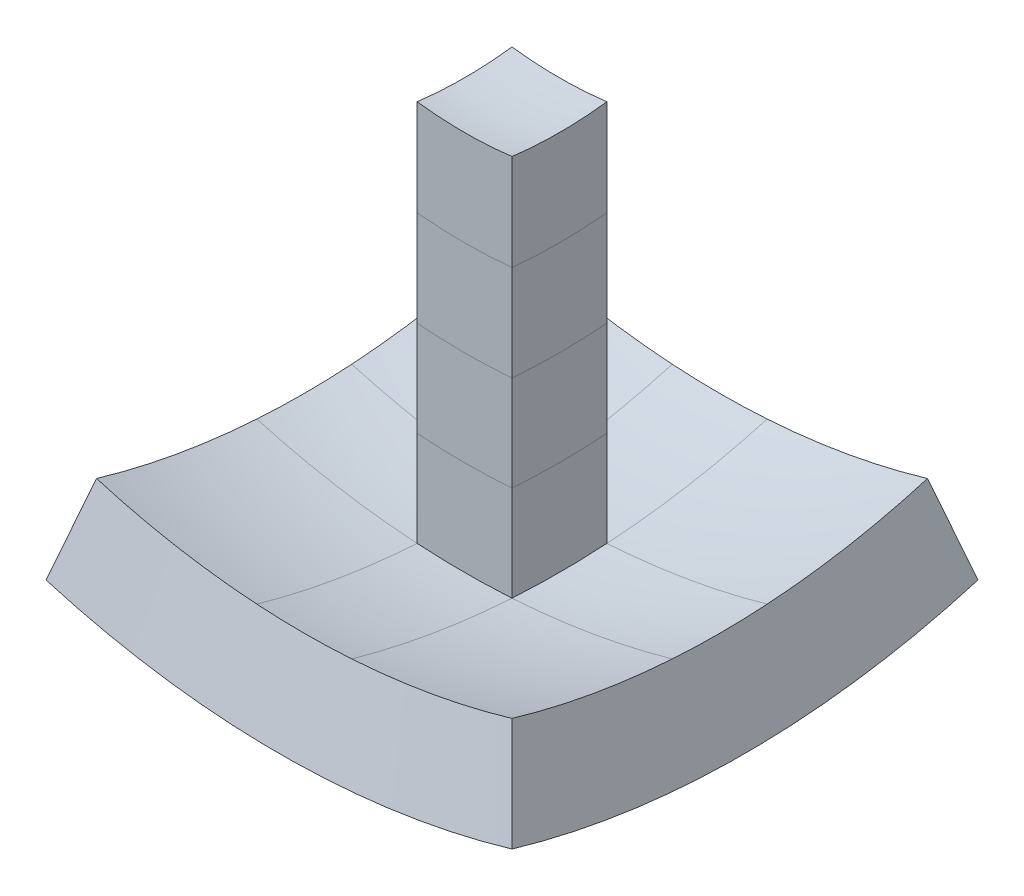
ISO-10303-21;
HEADER;
FILE_DESCRIPTION(('STEP AP214'),'2;1');
FILE_NAME('part.step','',(''),(''),'','','');
FILE_SCHEMA(('AUTOMOTIVE_DESIGN { 1 0 10303 214 1 1 1 1 }'));
ENDSEC;
DATA;
#1=APPLICATION_CONTEXT('core data for automotive mechanical design processes');
#2=APPLICATION_PROTOCOL_DEFINITION('international standard','automotive_design',2000,#1);
#3=PRODUCT_CONTEXT('',#1,'mechanical');
#4=PRODUCT('Part','Part','',(#3));
#5=PRODUCT_RELATED_PRODUCT_CATEGORY('part','',(#4));
#6=PRODUCT_DEFINITION_FORMATION('','',#4);
#7=PRODUCT_DEFINITION_CONTEXT('part definition',#1,'design');
#8=PRODUCT_DEFINITION('design','',#6,#7);
#9=PRODUCT_DEFINITION_SHAPE('','',#8);
#10=(LENGTH_UNIT() NAMED_UNIT(*) SI_UNIT(.MILLI.,.METRE.));
#11=(NAMED_UNIT(*) PLANE_ANGLE_UNIT() SI_UNIT($,.RADIAN.));
#12=(NAMED_UNIT(*) SI_UNIT($,.STERADIAN.) SOLID_ANGLE_UNIT());
#13=UNCERTAINTY_MEASURE_WITH_UNIT(LENGTH_MEASURE(1.E-05),#10,'distance_accuracy_value','');
#14=(GEOMETRIC_REPRESENTATION_CONTEXT(3) GLOBAL_UNCERTAINTY_ASSIGNED_CONTEXT((#13)) GLOBAL_UNIT_ASSIGNED_CONTEXT((#10,
#11,#12)) REPRESENTATION_CONTEXT('',''));
#15=CARTESIAN_POINT('',(0.,0.,0.));
#16=DIRECTION('',(0.,0.,1.));
#17=DIRECTION('',(1.,0.,0.));
#18=AXIS2_PLACEMENT_3D('',#15,#16,#17);
#19=CARTESIAN_POINT('',(0.,0.,0.));
#20=DIRECTION('',(0.,0.,1.));
#21=DIRECTION('',(1.,0.,0.));
#22=AXIS2_PLACEMENT_3D('',#19,#20,#21);
#23=SPHERICAL_SURFACE('',#22,31.0257167104902);
#24=CARTESIAN_POINT('',(0.,0.,3.93001566353264));
#25=DIRECTION('',(0.,0.,1.));
#26=DIRECTION('',(-1.,0.,0.));
#27=AXIS2_PLACEMENT_3D('',#24,#25,#26);
#28=CIRCLE('',#27,30.7758033897408);
#29=CARTESIAN_POINT('',(-8.46895918869349,-29.587612349499,3.93001566353254));
#30=VERTEX_POINT('',#29);
#31=CARTESIAN_POINT('',(-3.93001566353253,-30.5238439775918,3.93001566353253));
#32=VERTEX_POINT('',#31);
#33=EDGE_CURVE('E314',#30,#32,#28,.T.);
#34=ORIENTED_EDGE('',*,*,#33,.T.);
#35=CARTESIAN_POINT('',(-3.93001566353264,0.,0.));
#36=DIRECTION('',(-1.,0.,0.));
#37=DIRECTION('',(0.,-1.,0.));
#38=AXIS2_PLACEMENT_3D('',#35,#36,#37);
#39=CIRCLE('',#38,30.7758033897408);
#40=CARTESIAN_POINT('',(-3.93001566353253,-29.587612349499,8.46895918869349));
#41=VERTEX_POINT('',#40);
#42=EDGE_CURVE('E49',#32,#41,#39,.T.);
#43=ORIENTED_EDGE('',*,*,#42,.T.);
#44=CARTESIAN_POINT('',(0.,0.,8.46895918869359));
#45=DIRECTION('',(0.,0.,1.));
#46=DIRECTION('',(-1.,0.,0.));
#47=AXIS2_PLACEMENT_3D('',#44,#45,#46);
#48=CIRCLE('',#47,29.8474760685026);
#49=CARTESIAN_POINT('',(-8.46895918869349,-28.6207714417358,8.46895918869349));
#50=VERTEX_POINT('',#49);
#51=EDGE_CURVE('E113',#50,#41,#48,.T.);
#52=ORIENTED_EDGE('',*,*,#51,.F.);
#53=CARTESIAN_POINT('',(-8.4689591886936,0.,0.));
#54=DIRECTION('',(1.,0.,0.));
#55=DIRECTION('',(0.,1.,0.));
#56=AXIS2_PLACEMENT_3D('',#53,#54,#55);
#57=CIRCLE('',#56,29.8474760685026);
#58=EDGE_CURVE('E127',#50,#30,#57,.T.);
#59=ORIENTED_EDGE('',*,*,#58,.T.);
#60=EDGE_LOOP('',(#34,#43,#52,#59));
#61=FACE_BOUND('',#60,.T.);
#62=ADVANCED_FACE('F37',(#61),#23,.T.);
#63=CARTESIAN_POINT('',(32.5,0.,3.93001566353274));
#64=DIRECTION('',(0.,0.,1.));
#65=DIRECTION('',(-1.,0.,0.));
#66=AXIS2_PLACEMENT_3D('',#63,#64,#65);
#67=PLANE('',#66);
#68=DIRECTION('',(-1.,0.,0.));
#69=VECTOR('',#68,1.);
#70=CARTESIAN_POINT('',(-32.5,-32.5,3.93001566353261));
#71=LINE('',#70,#69);
#72=CARTESIAN_POINT('',(3.93001566353283,-32.5,3.93001566353254));
#73=VERTEX_POINT('',#72);
#74=CARTESIAN_POINT('',(-3.93001566353261,-32.5,3.93001566353254));
#75=VERTEX_POINT('',#74);
#76=EDGE_CURVE('E616',#73,#75,#71,.T.);
#77=ORIENTED_EDGE('',*,*,#76,.F.);
#78=DIRECTION('',(0.,1.,0.));
#79=VECTOR('',#78,1.);
#80=CARTESIAN_POINT('',(3.93001566353273,-1.08224922532E-13,3.93001566353273));
#81=LINE('',#80,#79);
#82=CARTESIAN_POINT('',(3.93001566353274,-30.5238439775918,3.93001566353253));
#83=VERTEX_POINT('',#82);
#84=EDGE_CURVE('E480',#73,#83,#81,.T.);
#85=ORIENTED_EDGE('',*,*,#84,.T.);
#86=EDGE_CURVE('E315',#32,#83,#28,.T.);
#87=ORIENTED_EDGE('',*,*,#86,.F.);
#88=DIRECTION('',(0.,-1.,0.));
#89=VECTOR('',#88,1.);
#90=CARTESIAN_POINT('',(-3.93001566353273,-1.47608381524858E-13,3.93001566353273));
#91=LINE('',#90,#89);
#92=EDGE_CURVE('E139',#32,#75,#91,.T.);
#93=ORIENTED_EDGE('',*,*,#92,.T.);
#94=EDGE_LOOP('',(#77,#85,#87,#93));
#95=FACE_BOUND('',#94,.T.);
#96=ADVANCED_FACE('F250',(#95),#67,.T.);
#97=CARTESIAN_POINT('',(3.93001566353262,32.5,0.));
#98=DIRECTION('',(1.,0.,0.));
#99=DIRECTION('',(0.,-1.,0.));
#100=AXIS2_PLACEMENT_3D('',#97,#98,#99);
#101=PLANE('',#100);
#102=DIRECTION('',(0.,0.,1.));
#103=VECTOR('',#102,1.);
#104=CARTESIAN_POINT('',(3.93001566353283,-32.5,-32.5));
#105=LINE('',#104,#103);
#106=CARTESIAN_POINT('',(3.93001566353274,-32.5,-3.93001566353284));
#107=VERTEX_POINT('',#106);
#108=EDGE_CURVE('E544',#107,#73,#105,.T.);
#109=ORIENTED_EDGE('',*,*,#108,.F.);
#110=DIRECTION('',(0.,-1.,0.));
#111=VECTOR('',#110,1.);
#112=CARTESIAN_POINT('',(3.93001566353273,0.,-3.93001566353273));
#113=LINE('',#112,#111);
#114=CARTESIAN_POINT('',(3.93001566353274,-30.5238439775918,-3.93001566353275));
#115=VERTEX_POINT('',#114);
#116=EDGE_CURVE('E404',#115,#107,#113,.T.);
#117=ORIENTED_EDGE('',*,*,#116,.F.);
#118=CARTESIAN_POINT('',(3.93001566353264,0.,0.));
#119=DIRECTION('',(-1.,0.,0.));
#120=DIRECTION('',(0.,-1.,0.));
#121=AXIS2_PLACEMENT_3D('',#118,#119,#120);
#122=CIRCLE('',#121,30.7758033897408);
#123=EDGE_CURVE('E142',#115,#83,#122,.T.);
#124=ORIENTED_EDGE('',*,*,#123,.T.);
#125=ORIENTED_EDGE('',*,*,#84,.F.);
#126=EDGE_LOOP('',(#109,#117,#124,#125));
#127=FACE_BOUND('',#126,.T.);
#128=ADVANCED_FACE('F258',(#127),#101,.T.);
#129=ORIENTED_EDGE('',*,*,#42,.F.);
#130=ORIENTED_EDGE('',*,*,#86,.T.);
#131=CARTESIAN_POINT('',(3.93001566353274,-29.5876123494989,8.46895918869349));
#132=VERTEX_POINT('',#131);
#133=EDGE_CURVE('E134',#83,#132,#122,.T.);
#134=ORIENTED_EDGE('',*,*,#133,.T.);
#135=EDGE_CURVE('E57',#41,#132,#48,.T.);
#136=ORIENTED_EDGE('',*,*,#135,.F.);
#137=EDGE_LOOP('',(#129,#130,#134,#136));
#138=FACE_BOUND('',#137,.T.);
#139=ADVANCED_FACE('F264',(#138),#23,.T.);
#140=CARTESIAN_POINT('',(-3.93001566353285,32.4999999999999,0.));
#141=DIRECTION('',(-1.,0.,0.));
#142=DIRECTION('',(0.,-1.,0.));
#143=AXIS2_PLACEMENT_3D('',#140,#141,#142);
#144=PLANE('',#143);
#145=DIRECTION('',(0.,0.,-1.));
#146=VECTOR('',#145,1.);
#147=CARTESIAN_POINT('',(-3.93001566353261,-32.5,-32.5));
#148=LINE('',#147,#146);
#149=CARTESIAN_POINT('',(-3.93001566353256,-32.5,-3.93001566353284));
#150=VERTEX_POINT('',#149);
#151=EDGE_CURVE('E545',#75,#150,#148,.T.);
#152=ORIENTED_EDGE('',*,*,#151,.F.);
#153=ORIENTED_EDGE('',*,*,#92,.F.);
#154=CARTESIAN_POINT('',(-3.93001566353262,-30.5238439775918,-3.93001566353275));
#155=VERTEX_POINT('',#154);
#156=EDGE_CURVE('E11',#155,#32,#39,.T.);
#157=ORIENTED_EDGE('',*,*,#156,.F.);
#158=DIRECTION('',(0.,1.,0.));
#159=VECTOR('',#158,1.);
#160=CARTESIAN_POINT('',(-3.93001566353273,-1.20165228823687E-13,-3.93001566353273));
#161=LINE('',#160,#159);
#162=EDGE_CURVE('E406',#150,#155,#161,.T.);
#163=ORIENTED_EDGE('',*,*,#162,.F.);
#164=EDGE_LOOP('',(#152,#153,#157,#163));
#165=FACE_BOUND('',#164,.T.);
#166=ADVANCED_FACE('F261',(#165),#144,.T.);
#167=CARTESIAN_POINT('',(0.,0.,0.));
#168=DIRECTION('',(-1.,0.,0.));
#169=DIRECTION('',(0.,1.,0.));
#170=AXIS2_PLACEMENT_3D('',#167,#168,#169);
#171=SPHERICAL_SURFACE('',#170,31.0257167104902);
#172=CARTESIAN_POINT('',(0.,0.,-3.93001566353264));
#173=DIRECTION('',(0.,0.,1.));
#174=DIRECTION('',(-1.,0.,0.));
#175=AXIS2_PLACEMENT_3D('',#172,#173,#174);
#176=CIRCLE('',#175,30.7758033897408);
#177=CARTESIAN_POINT('',(-8.46895918869348,-29.5876123494989,-3.93001566353274));
#178=VERTEX_POINT('',#177);
#179=EDGE_CURVE('E329',#178,#155,#176,.T.);
#180=ORIENTED_EDGE('',*,*,#179,.T.);
#181=ORIENTED_EDGE('',*,*,#156,.T.);
#182=ORIENTED_EDGE('',*,*,#33,.F.);
#183=CARTESIAN_POINT('',(-8.46895918869359,0.,0.));
#184=DIRECTION('',(-1.,0.,0.));
#185=DIRECTION('',(0.,-1.,0.));
#186=AXIS2_PLACEMENT_3D('',#183,#184,#185);
#187=CIRCLE('',#186,29.8474760685026);
#188=EDGE_CURVE('E47',#178,#30,#187,.T.);
#189=ORIENTED_EDGE('',*,*,#188,.F.);
#190=EDGE_LOOP('',(#180,#181,#182,#189));
#191=FACE_BOUND('',#190,.T.);
#192=ADVANCED_FACE('F207',(#191),#171,.T.);
#193=CARTESIAN_POINT('',(32.5,0.,-3.93001566353274));
#194=DIRECTION('',(0.,0.,-1.));
#195=DIRECTION('',(-1.,0.,0.));
#196=AXIS2_PLACEMENT_3D('',#193,#194,#195);
#197=PLANE('',#196);
#198=DIRECTION('',(1.,0.,0.));
#199=VECTOR('',#198,1.);
#200=CARTESIAN_POINT('',(-32.5,-32.5,-3.93001566353283));
#201=LINE('',#200,#199);
#202=EDGE_CURVE('E356',#150,#107,#201,.T.);
#203=ORIENTED_EDGE('',*,*,#202,.F.);
#204=ORIENTED_EDGE('',*,*,#162,.T.);
#205=EDGE_CURVE('E326',#155,#115,#176,.T.);
#206=ORIENTED_EDGE('',*,*,#205,.T.);
#207=ORIENTED_EDGE('',*,*,#116,.T.);
#208=EDGE_LOOP('',(#203,#204,#206,#207));
#209=FACE_BOUND('',#208,.T.);
#210=ADVANCED_FACE('F255',(#209),#197,.T.);
#211=CARTESIAN_POINT('',(0.,0.,0.));
#212=DIRECTION('',(1.,0.,0.));
#213=DIRECTION('',(0.,1.,0.));
#214=AXIS2_PLACEMENT_3D('',#211,#212,#213);
#215=SPHERICAL_SURFACE('',#214,31.0257167104902);
#216=CARTESIAN_POINT('',(8.46895918869369,-29.5876123494989,-3.93001566353275));
#217=VERTEX_POINT('',#216);
#218=EDGE_CURVE('E330',#115,#217,#176,.T.);
#219=ORIENTED_EDGE('',*,*,#218,.T.);
#220=CARTESIAN_POINT('',(8.46895918869359,0.,0.));
#221=DIRECTION('',(-1.,0.,0.));
#222=DIRECTION('',(0.,-1.,0.));
#223=AXIS2_PLACEMENT_3D('',#220,#221,#222);
#224=CIRCLE('',#223,29.8474760685026);
#225=CARTESIAN_POINT('',(8.46895918869369,-29.5876123494989,3.93001566353254));
#226=VERTEX_POINT('',#225);
#227=EDGE_CURVE('E307',#217,#226,#224,.T.);
#228=ORIENTED_EDGE('',*,*,#227,.T.);
#229=EDGE_CURVE('E122',#83,#226,#28,.T.);
#230=ORIENTED_EDGE('',*,*,#229,.F.);
#231=ORIENTED_EDGE('',*,*,#123,.F.);
#232=EDGE_LOOP('',(#219,#228,#230,#231));
#233=FACE_BOUND('',#232,.T.);
#234=ADVANCED_FACE('F233',(#233),#215,.T.);
#235=CARTESIAN_POINT('',(0.,0.,0.));
#236=DIRECTION('',(0.,0.,-1.));
#237=DIRECTION('',(1.,0.,0.));
#238=AXIS2_PLACEMENT_3D('',#235,#236,#237);
#239=SPHERICAL_SURFACE('',#238,31.0257167104902);
#240=ORIENTED_EDGE('',*,*,#205,.F.);
#241=CARTESIAN_POINT('',(-3.93001566353273,0.,0.));
#242=DIRECTION('',(-1.,0.,0.));
#243=DIRECTION('',(0.,-1.,0.));
#244=AXIS2_PLACEMENT_3D('',#241,#242,#243);
#245=CIRCLE('',#244,30.7758033897408);
#246=CARTESIAN_POINT('',(-3.93001566353262,-29.5876123494989,-8.4689591886937));
#247=VERTEX_POINT('',#246);
#248=EDGE_CURVE('E179',#155,#247,#245,.F.);
#249=ORIENTED_EDGE('',*,*,#248,.T.);
#250=CARTESIAN_POINT('',(0.,0.,-8.46895918869359));
#251=DIRECTION('',(0.,0.,1.));
#252=DIRECTION('',(-1.,0.,0.));
#253=AXIS2_PLACEMENT_3D('',#250,#251,#252);
#254=CIRCLE('',#253,29.8474760685026);
#255=CARTESIAN_POINT('',(3.93001566353274,-29.5876123494989,-8.4689591886937));
#256=VERTEX_POINT('',#255);
#257=EDGE_CURVE('E85',#247,#256,#254,.T.);
#258=ORIENTED_EDGE('',*,*,#257,.T.);
#259=EDGE_CURVE('E141',#256,#115,#122,.T.);
#260=ORIENTED_EDGE('',*,*,#259,.T.);
#261=EDGE_LOOP('',(#240,#249,#258,#260));
#262=FACE_BOUND('',#261,.T.);
#263=ADVANCED_FACE('F190',(#262),#239,.T.);
#264=CARTESIAN_POINT('',(0.,0.,7.55096164403318));
#265=DIRECTION('',(0.,0.,1.));
#266=DIRECTION('',(-1.,0.,0.));
#267=AXIS2_PLACEMENT_3D('',#264,#265,#266);
#268=CONICAL_SURFACE('',#267,26.5234188806966,1.30134475047002);
#269=CARTESIAN_POINT('',(0.,0.,7.55096164403318));
#270=DIRECTION('',(0.,0.,1.));
#271=DIRECTION('',(-1.,0.,0.));
#272=AXIS2_PLACEMENT_3D('',#269,#270,#271);
#273=CIRCLE('',#272,26.5234188806966);
#274=CARTESIAN_POINT('',(-7.55096164403309,-25.4258672884768,7.55096164403309));
#275=VERTEX_POINT('',#274);
#276=CARTESIAN_POINT('',(-1.72419661025937,-26.4673174910126,7.55096164403309));
#277=VERTEX_POINT('',#276);
#278=EDGE_CURVE('E317',#275,#277,#273,.T.);
#279=ORIENTED_EDGE('',*,*,#278,.F.);
#280=CARTESIAN_POINT('',(-7.55076164403309,-25.4251712257405,7.55076164403309));
#281=CARTESIAN_POINT('',(-7.70382731093225,-25.9578876105136,7.70382731093225));
#282=CARTESIAN_POINT('',(-7.85689327310354,-26.4906038256047,7.85689327310354));
#283=CARTESIAN_POINT('',(-8.16302578799034,-27.5560359164224,8.16302578799034));
#284=CARTESIAN_POINT('',(-8.31609234070585,-28.0887517921491,8.31609234070585));
#285=CARTESIAN_POINT('',(-8.46915918869348,-28.6214674981937,8.46915918869349));
#286=B_SPLINE_CURVE_WITH_KNOTS('',3,(#280,#281,#282,#283,#284,#285),.UNSPECIFIED.,.F.,.F.,(4,2,
4),(0.,1.72505202540263,3.45010405080514),.UNSPECIFIED.);
#287=EDGE_CURVE('E133',#275,#50,#286,.T.);
#288=ORIENTED_EDGE('',*,*,#287,.T.);
#289=ORIENTED_EDGE('',*,*,#51,.T.);
#290=ORIENTED_EDGE('',*,*,#135,.T.);
#291=CARTESIAN_POINT('',(8.46895918869369,-28.6207714417357,8.4689591886935));
#292=VERTEX_POINT('',#291);
#293=EDGE_CURVE('E104',#132,#292,#48,.T.);
#294=ORIENTED_EDGE('',*,*,#293,.T.);
#295=CARTESIAN_POINT('',(8.46915918869369,-28.6214674981937,8.4691591886935));
#296=CARTESIAN_POINT('',(8.31609234070606,-28.0887517921491,8.31609234070586));
#297=CARTESIAN_POINT('',(8.16302578799054,-27.5560359164224,8.16302578799035));
#298=CARTESIAN_POINT('',(7.85689327310373,-26.4906038256046,7.85689327310355));
#299=CARTESIAN_POINT('',(7.70382731093244,-25.9578876105136,7.70382731093227));
#300=CARTESIAN_POINT('',(7.55076164403327,-25.4251712257405,7.5507616440331));
#301=B_SPLINE_CURVE_WITH_KNOTS('',3,(#295,#296,#297,#298,#299,#300),.UNSPECIFIED.,.F.,.F.,(4,2,
4),(0.,1.72505202540251,3.45010405080515),.UNSPECIFIED.);
#302=CARTESIAN_POINT('',(7.55096164403326,-25.4258672884767,7.5509616440331));
#303=VERTEX_POINT('',#302);
#304=EDGE_CURVE('E109',#292,#303,#301,.T.);
#305=ORIENTED_EDGE('',*,*,#304,.T.);
#306=CARTESIAN_POINT('',(1.72419661025956,-26.4673174910126,7.55096164403309));
#307=VERTEX_POINT('',#306);
#308=EDGE_CURVE('E94',#307,#303,#273,.T.);
#309=ORIENTED_EDGE('',*,*,#308,.F.);
#310=EDGE_CURVE('E319',#277,#307,#273,.T.);
#311=ORIENTED_EDGE('',*,*,#310,.F.);
#312=EDGE_LOOP('',(#279,#288,#289,#290,#294,#305,#309,#311));
#313=FACE_BOUND('',#312,.T.);
#314=ADVANCED_FACE('F107',(#313),#268,.F.);
#315=CARTESIAN_POINT('',(-7.55096164403318,0.,0.));
#316=DIRECTION('',(-1.,0.,0.));
#317=DIRECTION('',(0.,-1.,0.));
#318=AXIS2_PLACEMENT_3D('',#315,#316,#317);
#319=CONICAL_SURFACE('',#318,26.5234188806966,1.30134475047002);
#320=CARTESIAN_POINT('',(-8.46915918869349,-28.6214674981936,-8.46915918869369));
#321=CARTESIAN_POINT('',(-8.31609234070585,-28.0887517921491,-8.31609234070605));
#322=CARTESIAN_POINT('',(-8.16302578799034,-27.5560359164224,-8.16302578799053));
#323=CARTESIAN_POINT('',(-7.85689327310354,-26.4906038256046,-7.85689327310373));
#324=CARTESIAN_POINT('',(-7.70382731093225,-25.9578876105136,-7.70382731093244));
#325=CARTESIAN_POINT('',(-7.55076164403309,-25.4251712257404,-7.55076164403327));
#326=B_SPLINE_CURVE_WITH_KNOTS('',3,(#320,#321,#322,#323,#324,#325),.UNSPECIFIED.,.F.,.F.,(4,2,
4),(0.,1.72505202540251,3.45010405080515),.UNSPECIFIED.);
#327=CARTESIAN_POINT('',(-8.46895918869349,-28.6207714417357,-8.46895918869369));
#328=VERTEX_POINT('',#327);
#329=CARTESIAN_POINT('',(-7.55096164403309,-25.4258672884767,-7.55096164403327));
#330=VERTEX_POINT('',#329);
#331=EDGE_CURVE('E178',#328,#330,#326,.T.);
#332=ORIENTED_EDGE('',*,*,#331,.F.);
#333=CARTESIAN_POINT('',(-8.4689591886936,0.,0.));
#334=DIRECTION('',(1.,0.,0.));
#335=DIRECTION('',(0.,1.,0.));
#336=AXIS2_PLACEMENT_3D('',#333,#334,#335);
#337=CIRCLE('',#336,29.8474760685026);
#338=EDGE_CURVE('E344',#178,#328,#337,.T.);
#339=ORIENTED_EDGE('',*,*,#338,.F.);
#340=ORIENTED_EDGE('',*,*,#188,.T.);
#341=ORIENTED_EDGE('',*,*,#58,.F.);
#342=ORIENTED_EDGE('',*,*,#287,.F.);
#343=CARTESIAN_POINT('',(-7.55096164403318,0.,0.));
#344=DIRECTION('',(-1.,0.,0.));
#345=DIRECTION('',(0.,-1.,0.));
#346=AXIS2_PLACEMENT_3D('',#343,#344,#345);
#347=CIRCLE('',#346,26.5234188806966);
#348=CARTESIAN_POINT('',(-7.55096164403309,-26.4673174910126,1.72419661025939));
#349=VERTEX_POINT('',#348);
#350=EDGE_CURVE('E325',#349,#275,#347,.T.);
#351=ORIENTED_EDGE('',*,*,#350,.F.);
#352=CARTESIAN_POINT('',(-7.55096164403309,-26.4673174910126,-1.72419661025958));
#353=VERTEX_POINT('',#352);
#354=EDGE_CURVE('E479',#353,#349,#347,.T.);
#355=ORIENTED_EDGE('',*,*,#354,.F.);
#356=CARTESIAN_POINT('',(-7.55096164403319,0.,0.));
#357=DIRECTION('',(1.,0.,0.));
#358=DIRECTION('',(0.,1.,0.));
#359=AXIS2_PLACEMENT_3D('',#356,#357,#358);
#360=CIRCLE('',#359,26.5234188806966);
#361=EDGE_CURVE('E348',#330,#353,#360,.F.);
#362=ORIENTED_EDGE('',*,*,#361,.F.);
#363=EDGE_LOOP('',(#332,#339,#340,#341,#342,#351,#355,#362));
#364=FACE_BOUND('',#363,.T.);
#365=ADVANCED_FACE('F164',(#364),#319,.F.);
#366=ORIENTED_EDGE('',*,*,#133,.F.);
#367=ORIENTED_EDGE('',*,*,#229,.T.);
#368=CARTESIAN_POINT('',(8.4689591886936,0.,0.));
#369=DIRECTION('',(-1.,0.,0.));
#370=DIRECTION('',(0.,-1.,0.));
#371=AXIS2_PLACEMENT_3D('',#368,#369,#370);
#372=CIRCLE('',#371,29.8474760685026);
#373=EDGE_CURVE('E118',#226,#292,#372,.T.);
#374=ORIENTED_EDGE('',*,*,#373,.T.);
#375=ORIENTED_EDGE('',*,*,#293,.F.);
#376=EDGE_LOOP('',(#366,#367,#374,#375));
#377=FACE_BOUND('',#376,.T.);
#378=ADVANCED_FACE('F119',(#377),#23,.T.);
#379=ORIENTED_EDGE('',*,*,#179,.F.);
#380=ORIENTED_EDGE('',*,*,#338,.T.);
#381=EDGE_CURVE('E331',#328,#247,#254,.T.);
#382=ORIENTED_EDGE('',*,*,#381,.T.);
#383=ORIENTED_EDGE('',*,*,#248,.F.);
#384=EDGE_LOOP('',(#379,#380,#382,#383));
#385=FACE_BOUND('',#384,.T.);
#386=ADVANCED_FACE('F163',(#385),#239,.T.);
#387=CARTESIAN_POINT('',(7.55096164403318,0.,0.));
#388=DIRECTION('',(1.,0.,0.));
#389=DIRECTION('',(0.,-1.,0.));
#390=AXIS2_PLACEMENT_3D('',#387,#388,#389);
#391=CONICAL_SURFACE('',#390,26.5234188806966,1.30134475047002);
#392=CARTESIAN_POINT('',(7.55076164403327,-25.4251712257404,-7.55076164403328));
#393=CARTESIAN_POINT('',(7.70382731093244,-25.9578876105136,-7.70382731093245));
#394=CARTESIAN_POINT('',(7.85689327310373,-26.4906038256046,-7.85689327310374));
#395=CARTESIAN_POINT('',(8.16302578799054,-27.5560359164223,-8.16302578799054));
#396=CARTESIAN_POINT('',(8.31609234070606,-28.088751792149,-8.31609234070606));
#397=CARTESIAN_POINT('',(8.46915918869369,-28.6214674981936,-8.4691591886937));
#398=B_SPLINE_CURVE_WITH_KNOTS('',3,(#392,#393,#394,#395,#396,#397),.UNSPECIFIED.,.F.,.F.,(4,2,
4),(0.,1.72505202540264,3.45010405080516),.UNSPECIFIED.);
#399=CARTESIAN_POINT('',(7.55096164403327,-25.4258672884767,-7.55096164403327));
#400=VERTEX_POINT('',#399);
#401=CARTESIAN_POINT('',(8.46895918869369,-28.6207714417357,-8.4689591886937));
#402=VERTEX_POINT('',#401);
#403=EDGE_CURVE('E171',#400,#402,#398,.T.);
#404=ORIENTED_EDGE('',*,*,#403,.F.);
#405=CARTESIAN_POINT('',(7.55096164403319,0.,0.));
#406=DIRECTION('',(-1.,0.,0.));
#407=DIRECTION('',(0.,-1.,0.));
#408=AXIS2_PLACEMENT_3D('',#405,#406,#407);
#409=CIRCLE('',#408,26.5234188806966);
#410=CARTESIAN_POINT('',(7.55096164403328,-26.4673174910126,-1.72419661025958));
#411=VERTEX_POINT('',#410);
#412=EDGE_CURVE('E305',#411,#400,#409,.F.);
#413=ORIENTED_EDGE('',*,*,#412,.F.);
#414=CARTESIAN_POINT('',(7.55096164403318,0.,0.));
#415=DIRECTION('',(-1.,0.,0.));
#416=DIRECTION('',(0.,-1.,0.));
#417=AXIS2_PLACEMENT_3D('',#414,#415,#416);
#418=CIRCLE('',#417,26.5234188806966);
#419=CARTESIAN_POINT('',(7.55096164403327,-26.4673174910126,1.7241966102594));
#420=VERTEX_POINT('',#419);
#421=EDGE_CURVE('E295',#411,#420,#418,.T.);
#422=ORIENTED_EDGE('',*,*,#421,.T.);
#423=EDGE_CURVE('E132',#420,#303,#418,.T.);
#424=ORIENTED_EDGE('',*,*,#423,.T.);
#425=ORIENTED_EDGE('',*,*,#304,.F.);
#426=ORIENTED_EDGE('',*,*,#373,.F.);
#427=ORIENTED_EDGE('',*,*,#227,.F.);
#428=CARTESIAN_POINT('',(8.4689591886936,0.,0.));
#429=DIRECTION('',(-1.,0.,0.));
#430=DIRECTION('',(0.,-1.,0.));
#431=AXIS2_PLACEMENT_3D('',#428,#429,#430);
#432=CIRCLE('',#431,29.8474760685026);
#433=EDGE_CURVE('E343',#402,#217,#432,.T.);
#434=ORIENTED_EDGE('',*,*,#433,.F.);
#435=EDGE_LOOP('',(#404,#413,#422,#424,#425,#426,#427,#434));
#436=FACE_BOUND('',#435,.T.);
#437=ADVANCED_FACE('F130',(#436),#391,.F.);
#438=CARTESIAN_POINT('',(0.,0.,0.));
#439=DIRECTION('',(0.,0.,1.));
#440=DIRECTION('',(1.,0.,0.));
#441=AXIS2_PLACEMENT_3D('',#438,#439,#440);
#442=SPHERICAL_SURFACE('',#441,27.5773234899718);
#443=CARTESIAN_POINT('',(0.,0.,1.72419661025949));
#444=DIRECTION('',(0.,0.,1.));
#445=DIRECTION('',(-1.,0.,0.));
#446=AXIS2_PLACEMENT_3D('',#443,#444,#445);
#447=CIRCLE('',#446,27.5233703771853);
#448=CARTESIAN_POINT('',(-1.72419661025937,-27.4693112940403,1.72419661025939));
#449=VERTEX_POINT('',#448);
#450=EDGE_CURVE('E301',#349,#449,#447,.T.);
#451=ORIENTED_EDGE('',*,*,#450,.F.);
#452=ORIENTED_EDGE('',*,*,#350,.T.);
#453=ORIENTED_EDGE('',*,*,#278,.T.);
#454=CARTESIAN_POINT('',(-1.72419661025947,0.,0.));
#455=DIRECTION('',(-1.,0.,0.));
#456=DIRECTION('',(0.,-1.,0.));
#457=AXIS2_PLACEMENT_3D('',#454,#455,#456);
#458=CIRCLE('',#457,27.5233703771853);
#459=EDGE_CURVE('E293',#449,#277,#458,.T.);
#460=ORIENTED_EDGE('',*,*,#459,.F.);
#461=EDGE_LOOP('',(#451,#452,#453,#460));
#462=FACE_BOUND('',#461,.T.);
#463=ADVANCED_FACE('F162',(#462),#442,.F.);
#464=ORIENTED_EDGE('',*,*,#423,.F.);
#465=CARTESIAN_POINT('',(1.72419661025956,-27.4693112940403,1.72419661025939));
#466=VERTEX_POINT('',#465);
#467=EDGE_CURVE('E289',#466,#420,#447,.T.);
#468=ORIENTED_EDGE('',*,*,#467,.F.);
#469=CARTESIAN_POINT('',(1.72419661025947,0.,0.));
#470=DIRECTION('',(1.,0.,0.));
#471=DIRECTION('',(0.,1.,0.));
#472=AXIS2_PLACEMENT_3D('',#469,#470,#471);
#473=CIRCLE('',#472,27.5233703771853);
#474=EDGE_CURVE('E137',#307,#466,#473,.T.);
#475=ORIENTED_EDGE('',*,*,#474,.F.);
#476=ORIENTED_EDGE('',*,*,#308,.T.);
#477=EDGE_LOOP('',(#464,#468,#475,#476));
#478=FACE_BOUND('',#477,.T.);
#479=ADVANCED_FACE('F274',(#478),#442,.F.);
#480=EDGE_CURVE('E126',#449,#466,#447,.T.);
#481=ORIENTED_EDGE('',*,*,#480,.F.);
#482=ORIENTED_EDGE('',*,*,#459,.T.);
#483=ORIENTED_EDGE('',*,*,#310,.T.);
#484=ORIENTED_EDGE('',*,*,#474,.T.);
#485=EDGE_LOOP('',(#481,#482,#483,#484));
#486=FACE_BOUND('',#485,.T.);
#487=ADVANCED_FACE('F167',(#486),#442,.F.);
#488=CARTESIAN_POINT('',(0.,0.,-7.55096164403318));
#489=DIRECTION('',(0.,0.,-1.));
#490=DIRECTION('',(-1.,0.,0.));
#491=AXIS2_PLACEMENT_3D('',#488,#489,#490);
#492=CONICAL_SURFACE('',#491,26.5234188806966,1.30134475047002);
#493=ORIENTED_EDGE('',*,*,#381,.F.);
#494=ORIENTED_EDGE('',*,*,#331,.T.);
#495=CARTESIAN_POINT('',(0.,0.,-7.55096164403318));
#496=DIRECTION('',(0.,0.,1.));
#497=DIRECTION('',(-1.,0.,0.));
#498=AXIS2_PLACEMENT_3D('',#495,#496,#497);
#499=CIRCLE('',#498,26.5234188806966);
#500=CARTESIAN_POINT('',(-1.72419661025937,-26.4673174910126,-7.55096164403328));
#501=VERTEX_POINT('',#500);
#502=EDGE_CURVE('E337',#330,#501,#499,.T.);
#503=ORIENTED_EDGE('',*,*,#502,.T.);
#504=CARTESIAN_POINT('',(1.72419661025956,-26.4673174910126,-7.55096164403328));
#505=VERTEX_POINT('',#504);
#506=EDGE_CURVE('E333',#501,#505,#499,.T.);
#507=ORIENTED_EDGE('',*,*,#506,.T.);
#508=EDGE_CURVE('E338',#505,#400,#499,.T.);
#509=ORIENTED_EDGE('',*,*,#508,.T.);
#510=ORIENTED_EDGE('',*,*,#403,.T.);
#511=EDGE_CURVE('E81',#256,#402,#254,.T.);
#512=ORIENTED_EDGE('',*,*,#511,.F.);
#513=ORIENTED_EDGE('',*,*,#257,.F.);
#514=EDGE_LOOP('',(#493,#494,#503,#507,#509,#510,#512,#513));
#515=FACE_BOUND('',#514,.T.);
#516=ADVANCED_FACE('F165',(#515),#492,.F.);
#517=ORIENTED_EDGE('',*,*,#259,.F.);
#518=ORIENTED_EDGE('',*,*,#511,.T.);
#519=ORIENTED_EDGE('',*,*,#433,.T.);
#520=ORIENTED_EDGE('',*,*,#218,.F.);
#521=EDGE_LOOP('',(#517,#518,#519,#520));
#522=FACE_BOUND('',#521,.T.);
#523=ADVANCED_FACE('F189',(#522),#239,.T.);
#524=CARTESIAN_POINT('',(0.,0.,0.));
#525=DIRECTION('',(-1.,0.,0.));
#526=DIRECTION('',(0.,1.,0.));
#527=AXIS2_PLACEMENT_3D('',#524,#525,#526);
#528=SPHERICAL_SURFACE('',#527,27.5773234899718);
#529=CARTESIAN_POINT('',(0.,0.,-1.72419661025949));
#530=DIRECTION('',(0.,0.,1.));
#531=DIRECTION('',(-1.,0.,0.));
#532=AXIS2_PLACEMENT_3D('',#529,#530,#531);
#533=CIRCLE('',#532,27.5233703771853);
#534=CARTESIAN_POINT('',(-1.72419661025937,-27.4693112940403,-1.72419661025958));
#535=VERTEX_POINT('',#534);
#536=EDGE_CURVE('E339',#353,#535,#533,.T.);
#537=ORIENTED_EDGE('',*,*,#536,.F.);
#538=ORIENTED_EDGE('',*,*,#354,.T.);
#539=ORIENTED_EDGE('',*,*,#450,.T.);
#540=CARTESIAN_POINT('',(-1.72419661025949,0.,0.));
#541=DIRECTION('',(-1.,0.,0.));
#542=DIRECTION('',(0.,-1.,0.));
#543=AXIS2_PLACEMENT_3D('',#540,#541,#542);
#544=CIRCLE('',#543,27.5233703771853);
#545=EDGE_CURVE('E477',#535,#449,#544,.T.);
#546=ORIENTED_EDGE('',*,*,#545,.F.);
#547=EDGE_LOOP('',(#537,#538,#539,#546));
#548=FACE_BOUND('',#547,.T.);
#549=ADVANCED_FACE('F191',(#548),#528,.F.);
#550=CARTESIAN_POINT('',(0.,0.,0.));
#551=DIRECTION('',(0.,0.,-1.));
#552=DIRECTION('',(1.,0.,0.));
#553=AXIS2_PLACEMENT_3D('',#550,#551,#552);
#554=SPHERICAL_SURFACE('',#553,27.5773234899718);
#555=CARTESIAN_POINT('',(-1.72419661025947,0.,0.));
#556=DIRECTION('',(-1.,0.,0.));
#557=DIRECTION('',(0.,-1.,0.));
#558=AXIS2_PLACEMENT_3D('',#555,#556,#557);
#559=CIRCLE('',#558,27.5233703771853);
#560=EDGE_CURVE('E384',#501,#535,#559,.T.);
#561=ORIENTED_EDGE('',*,*,#560,.F.);
#562=ORIENTED_EDGE('',*,*,#502,.F.);
#563=ORIENTED_EDGE('',*,*,#361,.T.);
#564=ORIENTED_EDGE('',*,*,#536,.T.);
#565=EDGE_LOOP('',(#561,#562,#563,#564));
#566=FACE_BOUND('',#565,.T.);
#567=ADVANCED_FACE('F195',(#566),#554,.F.);
#568=CARTESIAN_POINT('',(1.72419661025947,0.,0.));
#569=DIRECTION('',(1.,0.,0.));
#570=DIRECTION('',(0.,1.,0.));
#571=AXIS2_PLACEMENT_3D('',#568,#569,#570);
#572=CIRCLE('',#571,27.5233703771853);
#573=CARTESIAN_POINT('',(1.72419661025956,-27.4693112940403,-1.72419661025958));
#574=VERTEX_POINT('',#573);
#575=EDGE_CURVE('E386',#574,#505,#572,.T.);
#576=ORIENTED_EDGE('',*,*,#575,.F.);
#577=EDGE_CURVE('E336',#574,#411,#533,.T.);
#578=ORIENTED_EDGE('',*,*,#577,.T.);
#579=ORIENTED_EDGE('',*,*,#412,.T.);
#580=ORIENTED_EDGE('',*,*,#508,.F.);
#581=EDGE_LOOP('',(#576,#578,#579,#580));
#582=FACE_BOUND('',#581,.T.);
#583=ADVANCED_FACE('F203',(#582),#554,.F.);
#584=CARTESIAN_POINT('',(0.,0.,0.));
#585=DIRECTION('',(1.,0.,0.));
#586=DIRECTION('',(0.,1.,0.));
#587=AXIS2_PLACEMENT_3D('',#584,#585,#586);
#588=SPHERICAL_SURFACE('',#587,27.5773234899718);
#589=ORIENTED_EDGE('',*,*,#577,.F.);
#590=CARTESIAN_POINT('',(1.72419661025949,0.,0.));
#591=DIRECTION('',(-1.,0.,0.));
#592=DIRECTION('',(0.,-1.,0.));
#593=AXIS2_PLACEMENT_3D('',#590,#591,#592);
#594=CIRCLE('',#593,27.5233703771853);
#595=EDGE_CURVE('E300',#574,#466,#594,.T.);
#596=ORIENTED_EDGE('',*,*,#595,.T.);
#597=ORIENTED_EDGE('',*,*,#467,.T.);
#598=ORIENTED_EDGE('',*,*,#421,.F.);
#599=EDGE_LOOP('',(#589,#596,#597,#598));
#600=FACE_BOUND('',#599,.T.);
#601=ADVANCED_FACE('F197',(#600),#588,.F.);
#602=ORIENTED_EDGE('',*,*,#506,.F.);
#603=ORIENTED_EDGE('',*,*,#560,.T.);
#604=EDGE_CURVE('E342',#535,#574,#533,.T.);
#605=ORIENTED_EDGE('',*,*,#604,.T.);
#606=ORIENTED_EDGE('',*,*,#575,.T.);
#607=EDGE_LOOP('',(#602,#603,#605,#606));
#608=FACE_BOUND('',#607,.T.);
#609=ADVANCED_FACE('F198',(#608),#554,.F.);
#610=CARTESIAN_POINT('',(20.6085360635235,0.,-1.72419661025944));
#611=DIRECTION('',(0.,0.,-1.));
#612=DIRECTION('',(-1.,0.,0.));
#613=AXIS2_PLACEMENT_3D('',#610,#611,#612);
#614=PLANE('',#613);
#615=CARTESIAN_POINT('',(0.,0.,-1.72419661025943));
#616=DIRECTION('',(0.,0.,-1.));
#617=DIRECTION('',(0.,1.,0.));
#618=AXIS2_PLACEMENT_3D('',#615,#616,#617);
#619=CIRCLE('',#618,13.6754863485694);
#620=CARTESIAN_POINT('',(1.72419661025948,-13.5663581302823,-1.72419661025948));
#621=VERTEX_POINT('',#620);
#622=CARTESIAN_POINT('',(-1.72419661025938,-13.5663581302823,-1.72419661025952));
#623=VERTEX_POINT('',#622);
#624=EDGE_CURVE('E593',#621,#623,#619,.T.);
#625=ORIENTED_EDGE('',*,*,#624,.F.);
#626=DIRECTION('',(0.,-1.,0.));
#627=VECTOR('',#626,1.);
#628=CARTESIAN_POINT('',(1.72419661025943,0.,-1.72419661025943));
#629=LINE('',#628,#627);
#630=CARTESIAN_POINT('',(1.72419661025949,-17.0587535600225,-1.72419661025949));
#631=VERTEX_POINT('',#630);
#632=EDGE_CURVE('E357',#621,#631,#629,.T.);
#633=ORIENTED_EDGE('',*,*,#632,.T.);
#634=CARTESIAN_POINT('',(0.,0.,-1.72419661025943));
#635=DIRECTION('',(0.,0.,-1.));
#636=DIRECTION('',(0.,1.,0.));
#637=AXIS2_PLACEMENT_3D('',#634,#635,#636);
#638=CIRCLE('',#637,17.1456678777005);
#639=CARTESIAN_POINT('',(-1.72419661025932,-17.0587535600225,-1.72419661025944));
#640=VERTEX_POINT('',#639);
#641=EDGE_CURVE('E369',#640,#631,#638,.F.);
#642=ORIENTED_EDGE('',*,*,#641,.F.);
#643=DIRECTION('',(0.,1.,0.));
#644=VECTOR('',#643,1.);
#645=CARTESIAN_POINT('',(-1.72419661025943,0.,-1.72419661025947));
#646=LINE('',#645,#644);
#647=EDGE_CURVE('E372',#640,#623,#646,.T.);
#648=ORIENTED_EDGE('',*,*,#647,.T.);
#649=EDGE_LOOP('',(#625,#633,#642,#648));
#650=FACE_BOUND('',#649,.T.);
#651=ADVANCED_FACE('F201',(#650),#614,.T.);
#652=CARTESIAN_POINT('',(1.72419661025937,20.6085360635235,0.));
#653=DIRECTION('',(1.,0.,0.));
#654=DIRECTION('',(0.,-1.,0.));
#655=AXIS2_PLACEMENT_3D('',#652,#653,#654);
#656=PLANE('',#655);
#657=CARTESIAN_POINT('',(1.72419661025943,0.,0.));
#658=DIRECTION('',(1.,0.,0.));
#659=DIRECTION('',(0.,1.,0.));
#660=AXIS2_PLACEMENT_3D('',#657,#658,#659);
#661=CIRCLE('',#660,13.6754863485694);
#662=CARTESIAN_POINT('',(1.72419661025948,-13.5663581302823,1.72419661025939));
#663=VERTEX_POINT('',#662);
#664=EDGE_CURVE('E615',#663,#621,#661,.T.);
#665=ORIENTED_EDGE('',*,*,#664,.F.);
#666=DIRECTION('',(0.,1.,0.));
#667=VECTOR('',#666,1.);
#668=CARTESIAN_POINT('',(1.72419661025943,0.,1.72419661025947));
#669=LINE('',#668,#667);
#670=CARTESIAN_POINT('',(1.72419661025949,-17.0587535600225,1.72419661025932));
#671=VERTEX_POINT('',#670);
#672=EDGE_CURVE('E442',#671,#663,#669,.T.);
#673=ORIENTED_EDGE('',*,*,#672,.F.);
#674=CARTESIAN_POINT('',(1.72419661025943,0.,0.));
#675=DIRECTION('',(1.,0.,0.));
#676=DIRECTION('',(0.,1.,0.));
#677=AXIS2_PLACEMENT_3D('',#674,#675,#676);
#678=CIRCLE('',#677,17.1456678777005);
#679=EDGE_CURVE('E114',#631,#671,#678,.F.);
#680=ORIENTED_EDGE('',*,*,#679,.F.);
#681=ORIENTED_EDGE('',*,*,#632,.F.);
#682=EDGE_LOOP('',(#665,#673,#680,#681));
#683=FACE_BOUND('',#682,.T.);
#684=ADVANCED_FACE('F216',(#683),#656,.T.);
#685=CARTESIAN_POINT('',(0.,0.,-1.72419661025941));
#686=DIRECTION('',(0.,0.,1.));
#687=DIRECTION('',(-1.,0.,0.));
#688=AXIS2_PLACEMENT_3D('',#685,#686,#687);
#689=CIRCLE('',#688,20.6085360635235);
#690=CARTESIAN_POINT('',(-1.72419661025936,-20.5362826414791,-1.72419661025951));
#691=VERTEX_POINT('',#690);
#692=CARTESIAN_POINT('',(1.7241966102595,-20.5362826414791,-1.72419661025948));
#693=VERTEX_POINT('',#692);
#694=EDGE_CURVE('E349',#691,#693,#689,.T.);
#695=ORIENTED_EDGE('',*,*,#694,.F.);
#696=DIRECTION('',(0.,1.,0.));
#697=VECTOR('',#696,1.);
#698=CARTESIAN_POINT('',(-1.72419661025943,0.,-1.72419661025943));
#699=LINE('',#698,#697);
#700=EDGE_CURVE('E366',#691,#640,#699,.T.);
#701=ORIENTED_EDGE('',*,*,#700,.T.);
#702=ORIENTED_EDGE('',*,*,#641,.T.);
#703=DIRECTION('',(0.,-1.,0.));
#704=VECTOR('',#703,1.);
#705=CARTESIAN_POINT('',(1.72419661025943,0.,-1.72419661025947));
#706=LINE('',#705,#704);
#707=EDGE_CURVE('E363',#631,#693,#706,.T.);
#708=ORIENTED_EDGE('',*,*,#707,.T.);
#709=EDGE_LOOP('',(#695,#701,#702,#708));
#710=FACE_BOUND('',#709,.T.);
#711=ADVANCED_FACE('F214',(#710),#614,.T.);
#712=CARTESIAN_POINT('',(-1.72419661025951,20.6085360635234,0.));
#713=DIRECTION('',(-1.,0.,0.));
#714=DIRECTION('',(0.,-1.,0.));
#715=AXIS2_PLACEMENT_3D('',#712,#713,#714);
#716=PLANE('',#715);
#717=CARTESIAN_POINT('',(-1.72419661025943,0.,0.));
#718=DIRECTION('',(-1.,0.,0.));
#719=DIRECTION('',(0.,-1.,0.));
#720=AXIS2_PLACEMENT_3D('',#717,#718,#719);
#721=CIRCLE('',#720,13.6754863485694);
#722=CARTESIAN_POINT('',(-1.72419661025938,-13.5663581302823,1.72419661025939));
#723=VERTEX_POINT('',#722);
#724=EDGE_CURVE('E352',#623,#723,#721,.T.);
#725=ORIENTED_EDGE('',*,*,#724,.F.);
#726=ORIENTED_EDGE('',*,*,#647,.F.);
#727=CARTESIAN_POINT('',(-1.72419661025938,0.,0.));
#728=DIRECTION('',(-1.,0.,0.));
#729=DIRECTION('',(0.,-1.,0.));
#730=AXIS2_PLACEMENT_3D('',#727,#728,#729);
#731=CIRCLE('',#730,17.1456678777005);
#732=CARTESIAN_POINT('',(-1.72419661025932,-17.0587535600225,1.72419661025932));
#733=VERTEX_POINT('',#732);
#734=EDGE_CURVE('E562',#640,#733,#731,.T.);
#735=ORIENTED_EDGE('',*,*,#734,.T.);
#736=DIRECTION('',(0.,-1.,0.));
#737=VECTOR('',#736,1.);
#738=CARTESIAN_POINT('',(-1.72419661025943,-1.00808159032822E-13,1.72419661025947));
#739=LINE('',#738,#737);
#740=EDGE_CURVE('E445',#723,#733,#739,.T.);
#741=ORIENTED_EDGE('',*,*,#740,.F.);
#742=EDGE_LOOP('',(#725,#726,#735,#741));
#743=FACE_BOUND('',#742,.T.);
#744=ADVANCED_FACE('F223',(#743),#716,.T.);
#745=CARTESIAN_POINT('',(20.6085360635235,0.,1.72419661025944));
#746=DIRECTION('',(0.,0.,1.));
#747=DIRECTION('',(-1.,0.,0.));
#748=AXIS2_PLACEMENT_3D('',#745,#746,#747);
#749=PLANE('',#748);
#750=CARTESIAN_POINT('',(0.,0.,1.72419661025943));
#751=DIRECTION('',(0.,0.,1.));
#752=DIRECTION('',(0.,-1.,0.));
#753=AXIS2_PLACEMENT_3D('',#750,#751,#752);
#754=CIRCLE('',#753,13.6754863485694);
#755=EDGE_CURVE('E595',#723,#663,#754,.T.);
#756=ORIENTED_EDGE('',*,*,#755,.F.);
#757=ORIENTED_EDGE('',*,*,#740,.T.);
#758=CARTESIAN_POINT('',(0.,0.,1.72419661025943));
#759=DIRECTION('',(0.,0.,1.));
#760=DIRECTION('',(0.,-1.,0.));
#761=AXIS2_PLACEMENT_3D('',#758,#759,#760);
#762=CIRCLE('',#761,17.1456678777005);
#763=EDGE_CURVE('E439',#671,#733,#762,.F.);
#764=ORIENTED_EDGE('',*,*,#763,.F.);
#765=ORIENTED_EDGE('',*,*,#672,.T.);
#766=EDGE_LOOP('',(#756,#757,#764,#765));
#767=FACE_BOUND('',#766,.T.);
#768=ADVANCED_FACE('F222',(#767),#749,.T.);
#769=ORIENTED_EDGE('',*,*,#707,.F.);
#770=ORIENTED_EDGE('',*,*,#679,.T.);
#771=DIRECTION('',(0.,1.,0.));
#772=VECTOR('',#771,1.);
#773=CARTESIAN_POINT('',(1.72419661025943,0.,1.72419661025947));
#774=LINE('',#773,#772);
#775=CARTESIAN_POINT('',(1.7241966102595,-20.5362826414791,1.72419661025934));
#776=VERTEX_POINT('',#775);
#777=EDGE_CURVE('E428',#776,#671,#774,.T.);
#778=ORIENTED_EDGE('',*,*,#777,.F.);
#779=CARTESIAN_POINT('',(1.72419661025941,0.,0.));
#780=DIRECTION('',(-1.,0.,0.));
#781=DIRECTION('',(0.,-1.,0.));
#782=AXIS2_PLACEMENT_3D('',#779,#780,#781);
#783=CIRCLE('',#782,20.6085360635235);
#784=EDGE_CURVE('E309',#693,#776,#783,.T.);
#785=ORIENTED_EDGE('',*,*,#784,.F.);
#786=EDGE_LOOP('',(#769,#770,#778,#785));
#787=FACE_BOUND('',#786,.T.);
#788=ADVANCED_FACE('F220',(#787),#656,.T.);
#789=ORIENTED_EDGE('',*,*,#700,.F.);
#790=CARTESIAN_POINT('',(-1.72419661025941,0.,0.));
#791=DIRECTION('',(-1.,0.,0.));
#792=DIRECTION('',(0.,-1.,0.));
#793=AXIS2_PLACEMENT_3D('',#790,#791,#792);
#794=CIRCLE('',#793,20.6085360635235);
#795=CARTESIAN_POINT('',(-1.72419661025934,-20.5362826414791,1.72419661025934));
#796=VERTEX_POINT('',#795);
#797=EDGE_CURVE('E41',#691,#796,#794,.T.);
#798=ORIENTED_EDGE('',*,*,#797,.T.);
#799=DIRECTION('',(0.,-1.,0.));
#800=VECTOR('',#799,1.);
#801=CARTESIAN_POINT('',(-1.72419661025943,-1.00808159032822E-13,1.72419661025947));
#802=LINE('',#801,#800);
#803=EDGE_CURVE('E436',#733,#796,#802,.T.);
#804=ORIENTED_EDGE('',*,*,#803,.F.);
#805=ORIENTED_EDGE('',*,*,#734,.F.);
#806=EDGE_LOOP('',(#789,#798,#804,#805));
#807=FACE_BOUND('',#806,.T.);
#808=ADVANCED_FACE('F227',(#807),#716,.T.);
#809=CARTESIAN_POINT('',(0.,0.,1.72419661025941));
#810=DIRECTION('',(0.,0.,1.));
#811=DIRECTION('',(-1.,0.,0.));
#812=AXIS2_PLACEMENT_3D('',#809,#810,#811);
#813=CIRCLE('',#812,20.6085360635235);
#814=EDGE_CURVE('E433',#796,#776,#813,.T.);
#815=ORIENTED_EDGE('',*,*,#814,.T.);
#816=ORIENTED_EDGE('',*,*,#777,.T.);
#817=ORIENTED_EDGE('',*,*,#763,.T.);
#818=ORIENTED_EDGE('',*,*,#803,.T.);
#819=EDGE_LOOP('',(#815,#816,#817,#818));
#820=FACE_BOUND('',#819,.T.);
#821=ADVANCED_FACE('F212',(#820),#749,.T.);
#822=CARTESIAN_POINT('',(0.,0.,-1.72419661025945));
#823=DIRECTION('',(0.,0.,1.));
#824=DIRECTION('',(-1.,0.,0.));
#825=AXIS2_PLACEMENT_3D('',#822,#823,#824);
#826=CIRCLE('',#825,24.0672479107462);
#827=CARTESIAN_POINT('',(-1.72419661025938,-24.0054070585459,-1.72419661025953));
#828=VERTEX_POINT('',#827);
#829=CARTESIAN_POINT('',(1.72419661025955,-24.0054070585459,-1.72419661025954));
#830=VERTEX_POINT('',#829);
#831=EDGE_CURVE('E375',#828,#830,#826,.T.);
#832=ORIENTED_EDGE('',*,*,#831,.F.);
#833=DIRECTION('',(0.,1.,0.));
#834=VECTOR('',#833,1.);
#835=CARTESIAN_POINT('',(-1.72419661025943,0.,-1.72419661025947));
#836=LINE('',#835,#834);
#837=EDGE_CURVE('E353',#828,#691,#836,.T.);
#838=ORIENTED_EDGE('',*,*,#837,.T.);
#839=ORIENTED_EDGE('',*,*,#694,.T.);
#840=DIRECTION('',(0.,-1.,0.));
#841=VECTOR('',#840,1.);
#842=CARTESIAN_POINT('',(1.72419661025943,0.,-1.72419661025943));
#843=LINE('',#842,#841);
#844=EDGE_CURVE('E360',#693,#830,#843,.T.);
#845=ORIENTED_EDGE('',*,*,#844,.T.);
#846=EDGE_LOOP('',(#832,#838,#839,#845));
#847=FACE_BOUND('',#846,.T.);
#848=ADVANCED_FACE('F208',(#847),#614,.T.);
#849=ORIENTED_EDGE('',*,*,#844,.F.);
#850=ORIENTED_EDGE('',*,*,#784,.T.);
#851=DIRECTION('',(0.,1.,0.));
#852=VECTOR('',#851,1.);
#853=CARTESIAN_POINT('',(1.72419661025943,0.,1.72419661025943));
#854=LINE('',#853,#852);
#855=CARTESIAN_POINT('',(1.72419661025955,-24.0054070585459,1.72419661025937));
#856=VERTEX_POINT('',#855);
#857=EDGE_CURVE('E415',#856,#776,#854,.T.);
#858=ORIENTED_EDGE('',*,*,#857,.F.);
#859=CARTESIAN_POINT('',(1.72419661025945,0.,0.));
#860=DIRECTION('',(-1.,0.,0.));
#861=DIRECTION('',(0.,-1.,0.));
#862=AXIS2_PLACEMENT_3D('',#859,#860,#861);
#863=CIRCLE('',#862,24.0672479107462);
#864=EDGE_CURVE('E490',#830,#856,#863,.T.);
#865=ORIENTED_EDGE('',*,*,#864,.F.);
#866=EDGE_LOOP('',(#849,#850,#858,#865));
#867=FACE_BOUND('',#866,.T.);
#868=ADVANCED_FACE('F211',(#867),#656,.T.);
#869=ORIENTED_EDGE('',*,*,#837,.F.);
#870=CARTESIAN_POINT('',(-1.72419661025945,0.,0.));
#871=DIRECTION('',(-1.,0.,0.));
#872=DIRECTION('',(0.,-1.,0.));
#873=AXIS2_PLACEMENT_3D('',#870,#871,#872);
#874=CIRCLE('',#873,24.0672479107462);
#875=CARTESIAN_POINT('',(-1.72419661025936,-24.0054070585459,1.72419661025937));
#876=VERTEX_POINT('',#875);
#877=EDGE_CURVE('E564',#828,#876,#874,.T.);
#878=ORIENTED_EDGE('',*,*,#877,.T.);
#879=DIRECTION('',(0.,-1.,0.));
#880=VECTOR('',#879,1.);
#881=CARTESIAN_POINT('',(-1.72419661025943,0.,1.72419661025943));
#882=LINE('',#881,#880);
#883=EDGE_CURVE('E421',#796,#876,#882,.T.);
#884=ORIENTED_EDGE('',*,*,#883,.F.);
#885=ORIENTED_EDGE('',*,*,#797,.F.);
#886=EDGE_LOOP('',(#869,#878,#884,#885));
#887=FACE_BOUND('',#886,.T.);
#888=ADVANCED_FACE('F215',(#887),#716,.T.);
#889=CARTESIAN_POINT('',(0.,0.,1.72419661025945));
#890=DIRECTION('',(0.,0.,1.));
#891=DIRECTION('',(-1.,0.,0.));
#892=AXIS2_PLACEMENT_3D('',#889,#890,#891);
#893=CIRCLE('',#892,24.0672479107462);
#894=EDGE_CURVE('E322',#876,#856,#893,.T.);
#895=ORIENTED_EDGE('',*,*,#894,.T.);
#896=ORIENTED_EDGE('',*,*,#857,.T.);
#897=ORIENTED_EDGE('',*,*,#814,.F.);
#898=ORIENTED_EDGE('',*,*,#883,.T.);
#899=EDGE_LOOP('',(#895,#896,#897,#898));
#900=FACE_BOUND('',#899,.T.);
#901=ADVANCED_FACE('F228',(#900),#749,.T.);
#902=CARTESIAN_POINT('',(24.0672479107462,0.,-1.72419661025947));
#903=DIRECTION('',(0.,0.,-1.));
#904=DIRECTION('',(-1.,0.,0.));
#905=AXIS2_PLACEMENT_3D('',#902,#903,#904);
#906=PLANE('',#905);
#907=ORIENTED_EDGE('',*,*,#831,.T.);
#908=DIRECTION('',(0.,-1.,0.));
#909=VECTOR('',#908,1.);
#910=CARTESIAN_POINT('',(1.72419661025947,0.,-1.72419661025947));
#911=LINE('',#910,#909);
#912=EDGE_CURVE('E381',#830,#574,#911,.T.);
#913=ORIENTED_EDGE('',*,*,#912,.T.);
#914=ORIENTED_EDGE('',*,*,#604,.F.);
#915=DIRECTION('',(0.,1.,0.));
#916=VECTOR('',#915,1.);
#917=CARTESIAN_POINT('',(-1.72419661025947,0.,-1.72419661025947));
#918=LINE('',#917,#916);
#919=EDGE_CURVE('E378',#535,#828,#918,.T.);
#920=ORIENTED_EDGE('',*,*,#919,.T.);
#921=EDGE_LOOP('',(#907,#913,#914,#920));
#922=FACE_BOUND('',#921,.T.);
#923=ADVANCED_FACE('F231',(#922),#906,.T.);
#924=CARTESIAN_POINT('',(-1.72419661025956,24.0672479107462,0.));
#925=DIRECTION('',(-1.,0.,0.));
#926=DIRECTION('',(0.,-1.,0.));
#927=AXIS2_PLACEMENT_3D('',#924,#925,#926);
#928=PLANE('',#927);
#929=ORIENTED_EDGE('',*,*,#919,.F.);
#930=ORIENTED_EDGE('',*,*,#545,.T.);
#931=DIRECTION('',(0.,-1.,0.));
#932=VECTOR('',#931,1.);
#933=CARTESIAN_POINT('',(-1.72419661025947,-1.00808159032822E-13,1.72419661025947));
#934=LINE('',#933,#932);
#935=EDGE_CURVE('E448',#876,#449,#934,.T.);
#936=ORIENTED_EDGE('',*,*,#935,.F.);
#937=ORIENTED_EDGE('',*,*,#877,.F.);
#938=EDGE_LOOP('',(#929,#930,#936,#937));
#939=FACE_BOUND('',#938,.T.);
#940=ADVANCED_FACE('F236',(#939),#928,.T.);
#941=CARTESIAN_POINT('',(24.0672479107462,0.,1.72419661025947));
#942=DIRECTION('',(0.,0.,1.));
#943=DIRECTION('',(-1.,0.,0.));
#944=AXIS2_PLACEMENT_3D('',#941,#942,#943);
#945=PLANE('',#944);
#946=ORIENTED_EDGE('',*,*,#894,.F.);
#947=ORIENTED_EDGE('',*,*,#935,.T.);
#948=ORIENTED_EDGE('',*,*,#480,.T.);
#949=DIRECTION('',(0.,1.,0.));
#950=VECTOR('',#949,1.);
#951=CARTESIAN_POINT('',(1.72419661025947,0.,1.72419661025947));
#952=LINE('',#951,#950);
#953=EDGE_CURVE('E451',#466,#856,#952,.T.);
#954=ORIENTED_EDGE('',*,*,#953,.T.);
#955=EDGE_LOOP('',(#946,#947,#948,#954));
#956=FACE_BOUND('',#955,.T.);
#957=ADVANCED_FACE('F240',(#956),#945,.T.);
#958=CARTESIAN_POINT('',(1.72419661025939,24.0672479107462,0.));
#959=DIRECTION('',(1.,0.,0.));
#960=DIRECTION('',(0.,-1.,0.));
#961=AXIS2_PLACEMENT_3D('',#958,#959,#960);
#962=PLANE('',#961);
#963=ORIENTED_EDGE('',*,*,#912,.F.);
#964=ORIENTED_EDGE('',*,*,#864,.T.);
#965=ORIENTED_EDGE('',*,*,#953,.F.);
#966=ORIENTED_EDGE('',*,*,#595,.F.);
#967=EDGE_LOOP('',(#963,#964,#965,#966));
#968=FACE_BOUND('',#967,.T.);
#969=ADVANCED_FACE('F242',(#968),#962,.T.);
#970=CARTESIAN_POINT('',(0.,0.,0.));
#971=DIRECTION('',(-1.,0.,0.));
#972=DIRECTION('',(0.,-1.,0.));
#973=AXIS2_PLACEMENT_3D('',#970,#971,#972);
#974=SPHERICAL_SURFACE('',#973,13.7837506078983);
#975=ORIENTED_EDGE('',*,*,#755,.T.);
#976=ORIENTED_EDGE('',*,*,#664,.T.);
#977=ORIENTED_EDGE('',*,*,#624,.T.);
#978=ORIENTED_EDGE('',*,*,#724,.T.);
#979=EDGE_LOOP('',(#975,#976,#977,#978));
#980=FACE_BOUND('',#979,.T.);
#981=ADVANCED_FACE('F221',(#980),#974,.F.);
#982=CARTESIAN_POINT('',(-32.5,-32.5,-32.5));
#983=DIRECTION('',(0.,-1.,0.));
#984=DIRECTION('',(0.,0.,-1.));
#985=AXIS2_PLACEMENT_3D('',#982,#983,#984);
#986=PLANE('',#985);
#987=ORIENTED_EDGE('',*,*,#151,.T.);
#988=ORIENTED_EDGE('',*,*,#202,.T.);
#989=ORIENTED_EDGE('',*,*,#108,.T.);
#990=ORIENTED_EDGE('',*,*,#76,.T.);
#991=EDGE_LOOP('',(#987,#988,#989,#990));
#992=FACE_BOUND('',#991,.T.);
#993=ADVANCED_FACE('F39',(#992),#986,.T.);
#994=CLOSED_SHELL('',(#62,#96,#128,#139,#166,#192,#210,#234,#263,#314,#365,#378,#386,#437,#463,
#479,#487,#516,#523,#549,#567,#583,#601,#609,#651,#684,#711,#744,#768,#788,#808,#821,#848,#868,
#888,#901,#923,#940,#957,#969,#981,#993));
#995=MANIFOLD_SOLID_BREP('B2',#994);
#996=ADVANCED_BREP_SHAPE_REPRESENTATION('',(#18,#995),#14);
#997=SHAPE_DEFINITION_REPRESENTATION(#9,#996);
ENDSEC;
END-ISO-10303-21;
